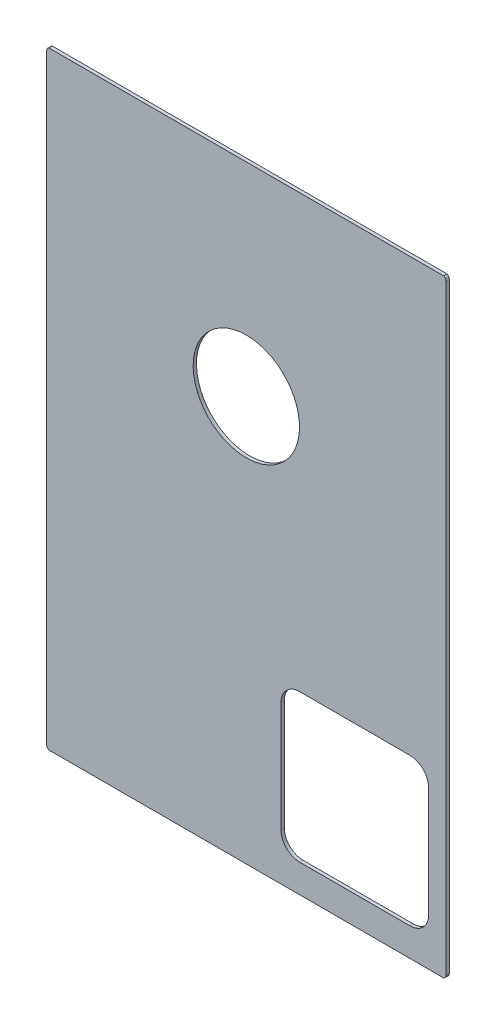
ISO-10303-21;
HEADER;
FILE_DESCRIPTION(('STEP AP214'),'2;1');
FILE_NAME('part.step','',(''),(''),'','','');
FILE_SCHEMA(('AUTOMOTIVE_DESIGN { 1 0 10303 214 1 1 1 1 }'));
ENDSEC;
DATA;
#1=APPLICATION_CONTEXT('core data for automotive mechanical design processes');
#2=APPLICATION_PROTOCOL_DEFINITION('international standard','automotive_design',2000,#1);
#3=PRODUCT_CONTEXT('',#1,'mechanical');
#4=PRODUCT('Part','Part','',(#3));
#5=PRODUCT_RELATED_PRODUCT_CATEGORY('part','',(#4));
#6=PRODUCT_DEFINITION_FORMATION('','',#4);
#7=PRODUCT_DEFINITION_CONTEXT('part definition',#1,'design');
#8=PRODUCT_DEFINITION('design','',#6,#7);
#9=PRODUCT_DEFINITION_SHAPE('','',#8);
#10=(LENGTH_UNIT() NAMED_UNIT(*) SI_UNIT(.MILLI.,.METRE.));
#11=(NAMED_UNIT(*) PLANE_ANGLE_UNIT() SI_UNIT($,.RADIAN.));
#12=(NAMED_UNIT(*) SI_UNIT($,.STERADIAN.) SOLID_ANGLE_UNIT());
#13=UNCERTAINTY_MEASURE_WITH_UNIT(LENGTH_MEASURE(1.E-05),#10,'distance_accuracy_value','');
#14=(GEOMETRIC_REPRESENTATION_CONTEXT(3) GLOBAL_UNCERTAINTY_ASSIGNED_CONTEXT((#13)) GLOBAL_UNIT_ASSIGNED_CONTEXT((#10,
#11,#12)) REPRESENTATION_CONTEXT('',''));
#15=CARTESIAN_POINT('',(0.,0.,0.));
#16=DIRECTION('',(0.,0.,1.));
#17=DIRECTION('',(1.,0.,0.));
#18=AXIS2_PLACEMENT_3D('',#15,#16,#17);
#19=CARTESIAN_POINT('',(0.,7.35,0.));
#20=DIRECTION('',(0.,-1.,0.));
#21=DIRECTION('',(0.,0.,-1.));
#22=AXIS2_PLACEMENT_3D('',#19,#20,#21);
#23=PLANE('',#22);
#24=DIRECTION('',(1.,0.,0.));
#25=VECTOR('',#24,1.);
#26=CARTESIAN_POINT('',(0.,7.35,0.));
#27=LINE('',#26,#25);
#28=CARTESIAN_POINT('',(8.5,7.35,0.));
#29=VERTEX_POINT('',#28);
#30=CARTESIAN_POINT('',(8.4000009125,7.35,0.));
#31=VERTEX_POINT('',#30);
#32=EDGE_CURVE('E175',#29,#31,#27,.F.);
#33=ORIENTED_EDGE('',*,*,#32,.F.);
#34=DIRECTION('',(0.,0.,-1.));
#35=VECTOR('',#34,1.);
#36=CARTESIAN_POINT('',(8.5,7.35,0.));
#37=LINE('',#36,#35);
#38=CARTESIAN_POINT('',(8.5,7.35,1.786));
#39=VERTEX_POINT('',#38);
#40=EDGE_CURVE('E178',#29,#39,#37,.F.);
#41=ORIENTED_EDGE('',*,*,#40,.T.);
#42=DIRECTION('',(1.,0.,0.));
#43=VECTOR('',#42,1.);
#44=CARTESIAN_POINT('',(0.,7.35,1.786));
#45=LINE('',#44,#43);
#46=CARTESIAN_POINT('',(8.4000009125,7.35,1.786));
#47=VERTEX_POINT('',#46);
#48=EDGE_CURVE('E161',#47,#39,#45,.T.);
#49=ORIENTED_EDGE('',*,*,#48,.F.);
#50=DIRECTION('',(0.,0.,-1.));
#51=VECTOR('',#50,1.);
#52=CARTESIAN_POINT('',(8.4,7.35,0.893));
#53=LINE('',#52,#51);
#54=EDGE_CURVE('E280',#47,#31,#53,.T.);
#55=ORIENTED_EDGE('',*,*,#54,.T.);
#56=EDGE_LOOP('',(#33,#41,#49,#55));
#57=FACE_BOUND('',#56,.T.);
#58=ADVANCED_FACE('F17',(#57),#23,.T.);
#59=CARTESIAN_POINT('',(217.8,0.,0.));
#60=DIRECTION('',(-1.,0.,0.));
#61=DIRECTION('',(0.,0.,1.));
#62=AXIS2_PLACEMENT_3D('',#59,#60,#61);
#63=PLANE('',#62);
#64=DIRECTION('',(0.,1.,0.));
#65=VECTOR('',#64,1.);
#66=CARTESIAN_POINT('',(217.8,0.,0.));
#67=LINE('',#66,#65);
#68=CARTESIAN_POINT('',(217.8,7.35,0.));
#69=VERTEX_POINT('',#68);
#70=CARTESIAN_POINT('',(217.8,7.55,0.));
#71=VERTEX_POINT('',#70);
#72=EDGE_CURVE('E186',#69,#71,#67,.T.);
#73=ORIENTED_EDGE('',*,*,#72,.F.);
#74=DIRECTION('',(0.,0.,-1.));
#75=VECTOR('',#74,1.);
#76=CARTESIAN_POINT('',(217.8,7.35,0.));
#77=LINE('',#76,#75);
#78=CARTESIAN_POINT('',(217.8,7.35,1.786));
#79=VERTEX_POINT('',#78);
#80=EDGE_CURVE('E277',#69,#79,#77,.F.);
#81=ORIENTED_EDGE('',*,*,#80,.T.);
#82=DIRECTION('',(0.,1.,0.));
#83=VECTOR('',#82,1.);
#84=CARTESIAN_POINT('',(217.8,0.,1.786));
#85=LINE('',#84,#83);
#86=CARTESIAN_POINT('',(217.8,7.55,1.786));
#87=VERTEX_POINT('',#86);
#88=EDGE_CURVE('E189',#87,#79,#85,.F.);
#89=ORIENTED_EDGE('',*,*,#88,.F.);
#90=DIRECTION('',(0.,0.,-1.));
#91=VECTOR('',#90,1.);
#92=CARTESIAN_POINT('',(217.8,7.55,0.));
#93=LINE('',#92,#91);
#94=EDGE_CURVE('E268',#87,#71,#93,.T.);
#95=ORIENTED_EDGE('',*,*,#94,.T.);
#96=EDGE_LOOP('',(#73,#81,#89,#95));
#97=FACE_BOUND('',#96,.T.);
#98=ADVANCED_FACE('F568',(#97),#63,.T.);
#99=CARTESIAN_POINT('',(8.5,0.,0.));
#100=DIRECTION('',(1.,0.,0.));
#101=DIRECTION('',(0.,0.,-1.));
#102=AXIS2_PLACEMENT_3D('',#99,#100,#101);
#103=PLANE('',#102);
#104=DIRECTION('',(0.,1.,0.));
#105=VECTOR('',#104,1.);
#106=CARTESIAN_POINT('',(8.5,0.,0.));
#107=LINE('',#106,#105);
#108=CARTESIAN_POINT('',(8.5,7.55,0.));
#109=VERTEX_POINT('',#108);
#110=EDGE_CURVE('E155',#109,#29,#107,.F.);
#111=ORIENTED_EDGE('',*,*,#110,.F.);
#112=DIRECTION('',(0.,0.,-1.));
#113=VECTOR('',#112,1.);
#114=CARTESIAN_POINT('',(8.5,7.55,0.));
#115=LINE('',#114,#113);
#116=CARTESIAN_POINT('',(8.5,7.55,1.786));
#117=VERTEX_POINT('',#116);
#118=EDGE_CURVE('E184',#109,#117,#115,.F.);
#119=ORIENTED_EDGE('',*,*,#118,.T.);
#120=DIRECTION('',(0.,1.,0.));
#121=VECTOR('',#120,1.);
#122=CARTESIAN_POINT('',(8.5,0.,1.786));
#123=LINE('',#122,#121);
#124=EDGE_CURVE('E167',#39,#117,#123,.T.);
#125=ORIENTED_EDGE('',*,*,#124,.F.);
#126=ORIENTED_EDGE('',*,*,#40,.F.);
#127=EDGE_LOOP('',(#111,#119,#125,#126));
#128=FACE_BOUND('',#127,.T.);
#129=ADVANCED_FACE('F182',(#128),#103,.T.);
#130=CARTESIAN_POINT('',(0.,7.35,0.));
#131=DIRECTION('',(0.,-1.,0.));
#132=DIRECTION('',(0.,0.,-1.));
#133=AXIS2_PLACEMENT_3D('',#130,#131,#132);
#134=PLANE('',#133);
#135=DIRECTION('',(1.,0.,0.));
#136=VECTOR('',#135,1.);
#137=CARTESIAN_POINT('',(0.,7.35,0.));
#138=LINE('',#137,#136);
#139=CARTESIAN_POINT('',(217.8999991,7.35,0.));
#140=VERTEX_POINT('',#139);
#141=EDGE_CURVE('E143',#140,#69,#138,.F.);
#142=ORIENTED_EDGE('',*,*,#141,.F.);
#143=DIRECTION('',(0.,0.,1.));
#144=VECTOR('',#143,1.);
#145=CARTESIAN_POINT('',(217.9,7.35,0.893));
#146=LINE('',#145,#144);
#147=CARTESIAN_POINT('',(217.8999991,7.35,1.786));
#148=VERTEX_POINT('',#147);
#149=EDGE_CURVE('E298',#140,#148,#146,.T.);
#150=ORIENTED_EDGE('',*,*,#149,.T.);
#151=DIRECTION('',(1.,0.,0.));
#152=VECTOR('',#151,1.);
#153=CARTESIAN_POINT('',(0.,7.35,1.786));
#154=LINE('',#153,#152);
#155=EDGE_CURVE('E180',#79,#148,#154,.T.);
#156=ORIENTED_EDGE('',*,*,#155,.F.);
#157=ORIENTED_EDGE('',*,*,#80,.F.);
#158=EDGE_LOOP('',(#142,#150,#156,#157));
#159=FACE_BOUND('',#158,.T.);
#160=ADVANCED_FACE('F551',(#159),#134,.T.);
#161=CARTESIAN_POINT('',(6.3,0.,0.));
#162=DIRECTION('',(-1.,0.,0.));
#163=DIRECTION('',(0.,0.,1.));
#164=AXIS2_PLACEMENT_3D('',#161,#162,#163);
#165=PLANE('',#164);
#166=DIRECTION('',(0.,1.,0.));
#167=VECTOR('',#166,1.);
#168=CARTESIAN_POINT('',(6.3,0.,0.));
#169=LINE('',#168,#167);
#170=CARTESIAN_POINT('',(6.30000001132748,331.0499991,0.));
#171=VERTEX_POINT('',#170);
#172=CARTESIAN_POINT('',(6.3,9.4500009125,0.));
#173=VERTEX_POINT('',#172);
#174=EDGE_CURVE('E223',#171,#173,#169,.F.);
#175=ORIENTED_EDGE('',*,*,#174,.T.);
#176=DIRECTION('',(0.,0.,1.));
#177=VECTOR('',#176,1.);
#178=CARTESIAN_POINT('',(6.3,9.45,0.893));
#179=LINE('',#178,#177);
#180=CARTESIAN_POINT('',(6.3,9.4500009125,1.786));
#181=VERTEX_POINT('',#180);
#182=EDGE_CURVE('E271',#173,#181,#179,.T.);
#183=ORIENTED_EDGE('',*,*,#182,.T.);
#184=DIRECTION('',(0.,1.,0.));
#185=VECTOR('',#184,1.);
#186=CARTESIAN_POINT('',(6.3,0.,1.786));
#187=LINE('',#186,#185);
#188=CARTESIAN_POINT('',(6.30000001132748,331.0499991,1.786));
#189=VERTEX_POINT('',#188);
#190=EDGE_CURVE('E248',#181,#189,#187,.T.);
#191=ORIENTED_EDGE('',*,*,#190,.T.);
#192=DIRECTION('',(0.,0.,-1.));
#193=VECTOR('',#192,1.);
#194=CARTESIAN_POINT('',(6.30000002265496,331.05,0.893));
#195=LINE('',#194,#193);
#196=EDGE_CURVE('E227',#189,#171,#195,.T.);
#197=ORIENTED_EDGE('',*,*,#196,.T.);
#198=EDGE_LOOP('',(#175,#183,#191,#197));
#199=FACE_BOUND('',#198,.T.);
#200=ADVANCED_FACE('F543',(#199),#165,.T.);
#201=CARTESIAN_POINT('',(8.400001825,9.450001825,0.));
#202=DIRECTION('',(0.,0.,1.));
#203=DIRECTION('',(1.,0.,0.));
#204=AXIS2_PLACEMENT_3D('',#201,#202,#203);
#205=CYLINDRICAL_SURFACE('',#204,2.10000182500079);
#206=CARTESIAN_POINT('',(8.400001825,9.450001825,0.));
#207=DIRECTION('',(0.,0.,1.));
#208=DIRECTION('',(1.,0.,0.));
#209=AXIS2_PLACEMENT_3D('',#206,#207,#208);
#210=CIRCLE('',#209,2.10000182500079);
#211=EDGE_CURVE('E220',#173,#31,#210,.T.);
#212=ORIENTED_EDGE('',*,*,#211,.T.);
#213=ORIENTED_EDGE('',*,*,#54,.F.);
#214=CARTESIAN_POINT('',(8.400001825,9.450001825,1.786));
#215=DIRECTION('',(0.,0.,1.));
#216=DIRECTION('',(1.,0.,0.));
#217=AXIS2_PLACEMENT_3D('',#214,#215,#216);
#218=CIRCLE('',#217,2.10000182500079);
#219=EDGE_CURVE('E171',#47,#181,#218,.F.);
#220=ORIENTED_EDGE('',*,*,#219,.T.);
#221=ORIENTED_EDGE('',*,*,#182,.F.);
#222=EDGE_LOOP('',(#212,#213,#220,#221));
#223=FACE_BOUND('',#222,.T.);
#224=ADVANCED_FACE('F535',(#223),#205,.T.);
#225=CARTESIAN_POINT('',(0.,7.55,0.));
#226=DIRECTION('',(0.,-1.,0.));
#227=DIRECTION('',(0.,0.,-1.));
#228=AXIS2_PLACEMENT_3D('',#225,#226,#227);
#229=PLANE('',#228);
#230=DIRECTION('',(1.,0.,0.));
#231=VECTOR('',#230,1.);
#232=CARTESIAN_POINT('',(0.,7.55,0.));
#233=LINE('',#232,#231);
#234=EDGE_CURVE('E219',#109,#71,#233,.T.);
#235=ORIENTED_EDGE('',*,*,#234,.T.);
#236=ORIENTED_EDGE('',*,*,#94,.F.);
#237=DIRECTION('',(1.,0.,0.));
#238=VECTOR('',#237,1.);
#239=CARTESIAN_POINT('',(0.,7.55,1.786));
#240=LINE('',#239,#238);
#241=EDGE_CURVE('E249',#87,#117,#240,.F.);
#242=ORIENTED_EDGE('',*,*,#241,.T.);
#243=ORIENTED_EDGE('',*,*,#118,.F.);
#244=EDGE_LOOP('',(#235,#236,#242,#243));
#245=FACE_BOUND('',#244,.T.);
#246=ADVANCED_FACE('F527',(#245),#229,.T.);
#247=CARTESIAN_POINT('',(217.8999982,9.450001825,0.));
#248=DIRECTION('',(0.,0.,1.));
#249=DIRECTION('',(1.,0.,0.));
#250=AXIS2_PLACEMENT_3D('',#247,#248,#249);
#251=CYLINDRICAL_SURFACE('',#250,2.10000182500077);
#252=CARTESIAN_POINT('',(217.8999982,9.450001825,0.));
#253=DIRECTION('',(0.,0.,1.));
#254=DIRECTION('',(1.,0.,0.));
#255=AXIS2_PLACEMENT_3D('',#252,#253,#254);
#256=CIRCLE('',#255,2.10000182500077);
#257=CARTESIAN_POINT('',(220.,9.4500009125,0.));
#258=VERTEX_POINT('',#257);
#259=EDGE_CURVE('E217',#140,#258,#256,.T.);
#260=ORIENTED_EDGE('',*,*,#259,.T.);
#261=DIRECTION('',(0.,0.,-1.));
#262=VECTOR('',#261,1.);
#263=CARTESIAN_POINT('',(220.,9.45,0.));
#264=LINE('',#263,#262);
#265=CARTESIAN_POINT('',(220.,9.4500009125,1.786));
#266=VERTEX_POINT('',#265);
#267=EDGE_CURVE('E134',#258,#266,#264,.F.);
#268=ORIENTED_EDGE('',*,*,#267,.T.);
#269=CARTESIAN_POINT('',(217.8999982,9.450001825,1.786));
#270=DIRECTION('',(0.,0.,1.));
#271=DIRECTION('',(1.,0.,0.));
#272=AXIS2_PLACEMENT_3D('',#269,#270,#271);
#273=CIRCLE('',#272,2.10000182500077);
#274=EDGE_CURVE('E20',#266,#148,#273,.F.);
#275=ORIENTED_EDGE('',*,*,#274,.T.);
#276=ORIENTED_EDGE('',*,*,#149,.F.);
#277=EDGE_LOOP('',(#260,#268,#275,#276));
#278=FACE_BOUND('',#277,.T.);
#279=ADVANCED_FACE('F519',(#278),#251,.T.);
#280=CARTESIAN_POINT('',(200.7,32.7,1.786));
#281=DIRECTION('',(0.,0.,-1.));
#282=DIRECTION('',(0.,1.,0.));
#283=AXIS2_PLACEMENT_3D('',#280,#281,#282);
#284=CYLINDRICAL_SURFACE('',#283,10.);
#285=CARTESIAN_POINT('',(200.7,32.7,0.));
#286=DIRECTION('',(0.,0.,-1.));
#287=DIRECTION('',(0.,1.,0.));
#288=AXIS2_PLACEMENT_3D('',#285,#286,#287);
#289=CIRCLE('',#288,10.);
#290=CARTESIAN_POINT('',(210.7,32.7,0.));
#291=VERTEX_POINT('',#290);
#292=CARTESIAN_POINT('',(200.7,22.7,0.));
#293=VERTEX_POINT('',#292);
#294=EDGE_CURVE('E214',#291,#293,#289,.T.);
#295=ORIENTED_EDGE('',*,*,#294,.T.);
#296=DIRECTION('',(0.,0.,-1.));
#297=VECTOR('',#296,1.);
#298=CARTESIAN_POINT('',(200.7,22.7,0.));
#299=LINE('',#298,#297);
#300=CARTESIAN_POINT('',(200.7,22.7,1.786));
#301=VERTEX_POINT('',#300);
#302=EDGE_CURVE('E301',#293,#301,#299,.F.);
#303=ORIENTED_EDGE('',*,*,#302,.T.);
#304=CARTESIAN_POINT('',(200.7,32.7,1.786));
#305=DIRECTION('',(0.,0.,-1.));
#306=DIRECTION('',(0.,1.,0.));
#307=AXIS2_PLACEMENT_3D('',#304,#305,#306);
#308=CIRCLE('',#307,10.);
#309=CARTESIAN_POINT('',(210.7,32.7,1.786));
#310=VERTEX_POINT('',#309);
#311=EDGE_CURVE('E233',#301,#310,#308,.F.);
#312=ORIENTED_EDGE('',*,*,#311,.T.);
#313=DIRECTION('',(0.,0.,1.));
#314=VECTOR('',#313,1.);
#315=CARTESIAN_POINT('',(210.7,32.7,0.));
#316=LINE('',#315,#314);
#317=EDGE_CURVE('E315',#310,#291,#316,.F.);
#318=ORIENTED_EDGE('',*,*,#317,.T.);
#319=EDGE_LOOP('',(#295,#303,#312,#318));
#320=FACE_BOUND('',#319,.T.);
#321=ADVANCED_FACE('F352',(#320),#284,.F.);
#322=CARTESIAN_POINT('',(0.,22.7,0.));
#323=DIRECTION('',(0.,-1.,0.));
#324=DIRECTION('',(0.,0.,-1.));
#325=AXIS2_PLACEMENT_3D('',#322,#323,#324);
#326=PLANE('',#325);
#327=DIRECTION('',(1.,0.,0.));
#328=VECTOR('',#327,1.);
#329=CARTESIAN_POINT('',(0.,22.7,0.));
#330=LINE('',#329,#328);
#331=CARTESIAN_POINT('',(141.7,22.7,0.));
#332=VERTEX_POINT('',#331);
#333=EDGE_CURVE('E213',#293,#332,#330,.F.);
#334=ORIENTED_EDGE('',*,*,#333,.T.);
#335=DIRECTION('',(0.,0.,-1.));
#336=VECTOR('',#335,1.);
#337=CARTESIAN_POINT('',(141.7,22.7,0.893));
#338=LINE('',#337,#336);
#339=CARTESIAN_POINT('',(141.7,22.7,1.786));
#340=VERTEX_POINT('',#339);
#341=EDGE_CURVE('E305',#332,#340,#338,.F.);
#342=ORIENTED_EDGE('',*,*,#341,.T.);
#343=DIRECTION('',(1.,0.,0.));
#344=VECTOR('',#343,1.);
#345=CARTESIAN_POINT('',(0.,22.7,1.786));
#346=LINE('',#345,#344);
#347=EDGE_CURVE('E236',#340,#301,#346,.T.);
#348=ORIENTED_EDGE('',*,*,#347,.T.);
#349=ORIENTED_EDGE('',*,*,#302,.F.);
#350=EDGE_LOOP('',(#334,#342,#348,#349));
#351=FACE_BOUND('',#350,.T.);
#352=ADVANCED_FACE('F354',(#351),#326,.F.);
#353=CARTESIAN_POINT('',(141.7,32.7,1.786));
#354=DIRECTION('',(0.,0.,-1.));
#355=DIRECTION('',(-1.,0.,0.));
#356=AXIS2_PLACEMENT_3D('',#353,#354,#355);
#357=CYLINDRICAL_SURFACE('',#356,10.);
#358=CARTESIAN_POINT('',(141.7,32.7,0.));
#359=DIRECTION('',(0.,0.,-1.));
#360=DIRECTION('',(-1.,0.,0.));
#361=AXIS2_PLACEMENT_3D('',#358,#359,#360);
#362=CIRCLE('',#361,10.);
#363=CARTESIAN_POINT('',(131.7,32.7,0.));
#364=VERTEX_POINT('',#363);
#365=EDGE_CURVE('E211',#332,#364,#362,.T.);
#366=ORIENTED_EDGE('',*,*,#365,.T.);
#367=DIRECTION('',(0.,0.,-1.));
#368=VECTOR('',#367,1.);
#369=CARTESIAN_POINT('',(131.7,32.7,0.));
#370=LINE('',#369,#368);
#371=CARTESIAN_POINT('',(131.7,32.7,1.786));
#372=VERTEX_POINT('',#371);
#373=EDGE_CURVE('E307',#364,#372,#370,.F.);
#374=ORIENTED_EDGE('',*,*,#373,.T.);
#375=CARTESIAN_POINT('',(141.7,32.7,1.786));
#376=DIRECTION('',(0.,0.,-1.));
#377=DIRECTION('',(-1.,0.,0.));
#378=AXIS2_PLACEMENT_3D('',#375,#376,#377);
#379=CIRCLE('',#378,10.);
#380=EDGE_CURVE('E237',#372,#340,#379,.F.);
#381=ORIENTED_EDGE('',*,*,#380,.T.);
#382=ORIENTED_EDGE('',*,*,#341,.F.);
#383=EDGE_LOOP('',(#366,#374,#381,#382));
#384=FACE_BOUND('',#383,.T.);
#385=ADVANCED_FACE('F381',(#384),#357,.F.);
#386=CARTESIAN_POINT('',(131.7,0.,0.));
#387=DIRECTION('',(1.,0.,0.));
#388=DIRECTION('',(0.,0.,-1.));
#389=AXIS2_PLACEMENT_3D('',#386,#387,#388);
#390=PLANE('',#389);
#391=ORIENTED_EDGE('',*,*,#373,.F.);
#392=DIRECTION('',(0.,1.,0.));
#393=VECTOR('',#392,1.);
#394=CARTESIAN_POINT('',(131.7,0.,0.));
#395=LINE('',#394,#393);
#396=CARTESIAN_POINT('',(131.7,91.7,0.));
#397=VERTEX_POINT('',#396);
#398=EDGE_CURVE('E210',#364,#397,#395,.T.);
#399=ORIENTED_EDGE('',*,*,#398,.T.);
#400=DIRECTION('',(0.,0.,-1.));
#401=VECTOR('',#400,1.);
#402=CARTESIAN_POINT('',(131.7,91.7,0.893));
#403=LINE('',#402,#401);
#404=CARTESIAN_POINT('',(131.7,91.7,1.786));
#405=VERTEX_POINT('',#404);
#406=EDGE_CURVE('E309',#397,#405,#403,.F.);
#407=ORIENTED_EDGE('',*,*,#406,.T.);
#408=DIRECTION('',(0.,1.,0.));
#409=VECTOR('',#408,1.);
#410=CARTESIAN_POINT('',(131.7,0.,1.786));
#411=LINE('',#410,#409);
#412=EDGE_CURVE('E240',#405,#372,#411,.F.);
#413=ORIENTED_EDGE('',*,*,#412,.T.);
#414=EDGE_LOOP('',(#391,#399,#407,#413));
#415=FACE_BOUND('',#414,.T.);
#416=ADVANCED_FACE('F379',(#415),#390,.T.);
#417=CARTESIAN_POINT('',(141.7,91.7,1.786));
#418=DIRECTION('',(0.,0.,-1.));
#419=DIRECTION('',(0.,1.,0.));
#420=AXIS2_PLACEMENT_3D('',#417,#418,#419);
#421=CYLINDRICAL_SURFACE('',#420,10.);
#422=CARTESIAN_POINT('',(141.7,91.7,0.));
#423=DIRECTION('',(0.,0.,-1.));
#424=DIRECTION('',(0.,1.,0.));
#425=AXIS2_PLACEMENT_3D('',#422,#423,#424);
#426=CIRCLE('',#425,10.);
#427=CARTESIAN_POINT('',(141.7,101.7,0.));
#428=VERTEX_POINT('',#427);
#429=EDGE_CURVE('E208',#397,#428,#426,.T.);
#430=ORIENTED_EDGE('',*,*,#429,.T.);
#431=DIRECTION('',(0.,0.,1.));
#432=VECTOR('',#431,1.);
#433=CARTESIAN_POINT('',(141.7,101.7,0.));
#434=LINE('',#433,#432);
#435=CARTESIAN_POINT('',(141.7,101.7,1.786));
#436=VERTEX_POINT('',#435);
#437=EDGE_CURVE('E311',#428,#436,#434,.T.);
#438=ORIENTED_EDGE('',*,*,#437,.T.);
#439=CARTESIAN_POINT('',(141.7,91.7,1.786));
#440=DIRECTION('',(0.,0.,-1.));
#441=DIRECTION('',(0.,1.,0.));
#442=AXIS2_PLACEMENT_3D('',#439,#440,#441);
#443=CIRCLE('',#442,10.);
#444=EDGE_CURVE('E241',#436,#405,#443,.F.);
#445=ORIENTED_EDGE('',*,*,#444,.T.);
#446=ORIENTED_EDGE('',*,*,#406,.F.);
#447=EDGE_LOOP('',(#430,#438,#445,#446));
#448=FACE_BOUND('',#447,.T.);
#449=ADVANCED_FACE('F374',(#448),#421,.F.);
#450=CARTESIAN_POINT('',(0.,101.7,0.));
#451=DIRECTION('',(0.,1.,0.));
#452=DIRECTION('',(0.,0.,1.));
#453=AXIS2_PLACEMENT_3D('',#450,#451,#452);
#454=PLANE('',#453);
#455=DIRECTION('',(1.,0.,0.));
#456=VECTOR('',#455,1.);
#457=CARTESIAN_POINT('',(0.,101.7,1.786));
#458=LINE('',#457,#456);
#459=CARTESIAN_POINT('',(200.7,101.7,1.786));
#460=VERTEX_POINT('',#459);
#461=EDGE_CURVE('E244',#460,#436,#458,.F.);
#462=ORIENTED_EDGE('',*,*,#461,.T.);
#463=ORIENTED_EDGE('',*,*,#437,.F.);
#464=DIRECTION('',(1.,0.,0.));
#465=VECTOR('',#464,1.);
#466=CARTESIAN_POINT('',(0.,101.7,0.));
#467=LINE('',#466,#465);
#468=CARTESIAN_POINT('',(200.7,101.7,0.));
#469=VERTEX_POINT('',#468);
#470=EDGE_CURVE('E207',#428,#469,#467,.T.);
#471=ORIENTED_EDGE('',*,*,#470,.T.);
#472=DIRECTION('',(0.,0.,-1.));
#473=VECTOR('',#472,1.);
#474=CARTESIAN_POINT('',(200.7,101.7,0.893));
#475=LINE('',#474,#473);
#476=EDGE_CURVE('E313',#469,#460,#475,.F.);
#477=ORIENTED_EDGE('',*,*,#476,.T.);
#478=EDGE_LOOP('',(#462,#463,#471,#477));
#479=FACE_BOUND('',#478,.T.);
#480=ADVANCED_FACE('F372',(#479),#454,.F.);
#481=CARTESIAN_POINT('',(200.7,91.7,1.786));
#482=DIRECTION('',(0.,0.,-1.));
#483=DIRECTION('',(-1.,0.,0.));
#484=AXIS2_PLACEMENT_3D('',#481,#482,#483);
#485=CYLINDRICAL_SURFACE('',#484,9.99999999999999);
#486=CARTESIAN_POINT('',(200.7,91.7,0.));
#487=DIRECTION('',(0.,0.,-1.));
#488=DIRECTION('',(-1.,0.,0.));
#489=AXIS2_PLACEMENT_3D('',#486,#487,#488);
#490=CIRCLE('',#489,9.99999999999999);
#491=CARTESIAN_POINT('',(210.7,91.7,0.));
#492=VERTEX_POINT('',#491);
#493=EDGE_CURVE('E205',#469,#492,#490,.T.);
#494=ORIENTED_EDGE('',*,*,#493,.T.);
#495=DIRECTION('',(0.,0.,1.));
#496=VECTOR('',#495,1.);
#497=CARTESIAN_POINT('',(210.7,91.7,0.));
#498=LINE('',#497,#496);
#499=CARTESIAN_POINT('',(210.7,91.7,1.786));
#500=VERTEX_POINT('',#499);
#501=EDGE_CURVE('E303',#492,#500,#498,.T.);
#502=ORIENTED_EDGE('',*,*,#501,.T.);
#503=CARTESIAN_POINT('',(200.7,91.7,1.786));
#504=DIRECTION('',(0.,0.,-1.));
#505=DIRECTION('',(-1.,0.,0.));
#506=AXIS2_PLACEMENT_3D('',#503,#504,#505);
#507=CIRCLE('',#506,9.99999999999999);
#508=EDGE_CURVE('E245',#500,#460,#507,.F.);
#509=ORIENTED_EDGE('',*,*,#508,.T.);
#510=ORIENTED_EDGE('',*,*,#476,.F.);
#511=EDGE_LOOP('',(#494,#502,#509,#510));
#512=FACE_BOUND('',#511,.T.);
#513=ADVANCED_FACE('F366',(#512),#485,.F.);
#514=CARTESIAN_POINT('',(210.7,0.,0.));
#515=DIRECTION('',(-1.,0.,0.));
#516=DIRECTION('',(0.,0.,1.));
#517=AXIS2_PLACEMENT_3D('',#514,#515,#516);
#518=PLANE('',#517);
#519=ORIENTED_EDGE('',*,*,#501,.F.);
#520=DIRECTION('',(0.,1.,0.));
#521=VECTOR('',#520,1.);
#522=CARTESIAN_POINT('',(210.7,0.,0.));
#523=LINE('',#522,#521);
#524=EDGE_CURVE('E204',#492,#291,#523,.F.);
#525=ORIENTED_EDGE('',*,*,#524,.T.);
#526=ORIENTED_EDGE('',*,*,#317,.F.);
#527=DIRECTION('',(0.,1.,0.));
#528=VECTOR('',#527,1.);
#529=CARTESIAN_POINT('',(210.7,0.,1.786));
#530=LINE('',#529,#528);
#531=EDGE_CURVE('E247',#310,#500,#530,.T.);
#532=ORIENTED_EDGE('',*,*,#531,.T.);
#533=EDGE_LOOP('',(#519,#525,#526,#532));
#534=FACE_BOUND('',#533,.T.);
#535=ADVANCED_FACE('F344',(#534),#518,.T.);
#536=CARTESIAN_POINT('',(113.145,224.253,1.786));
#537=DIRECTION('',(0.,0.,-1.));
#538=DIRECTION('',(0.,1.,0.));
#539=AXIS2_PLACEMENT_3D('',#536,#537,#538);
#540=CYLINDRICAL_SURFACE('',#539,28.4500000165081);
#541=CARTESIAN_POINT('',(113.145,224.253,0.));
#542=DIRECTION('',(0.,0.,-1.));
#543=DIRECTION('',(0.,1.,0.));
#544=AXIS2_PLACEMENT_3D('',#541,#542,#543);
#545=CIRCLE('',#544,28.4500000165081);
#546=CARTESIAN_POINT('',(113.145,252.703000016508,0.));
#547=VERTEX_POINT('',#546);
#548=EDGE_CURVE('E201',#547,#547,#545,.T.);
#549=ORIENTED_EDGE('',*,*,#548,.T.);
#550=EDGE_LOOP('',(#549));
#551=FACE_BOUND('',#550,.T.);
#552=CARTESIAN_POINT('',(113.145,224.253,1.786));
#553=DIRECTION('',(0.,0.,-1.));
#554=DIRECTION('',(0.,1.,0.));
#555=AXIS2_PLACEMENT_3D('',#552,#553,#554);
#556=CIRCLE('',#555,28.4500000252839);
#557=CARTESIAN_POINT('',(113.145,252.703000025284,1.786));
#558=VERTEX_POINT('',#557);
#559=EDGE_CURVE('E230',#558,#558,#556,.F.);
#560=ORIENTED_EDGE('',*,*,#559,.T.);
#561=EDGE_LOOP('',(#560));
#562=FACE_BOUND('',#561,.T.);
#563=ADVANCED_FACE('F415',(#551,#562),#540,.F.);
#564=CARTESIAN_POINT('',(220.,0.,0.));
#565=DIRECTION('',(1.,0.,0.));
#566=DIRECTION('',(0.,0.,-1.));
#567=AXIS2_PLACEMENT_3D('',#564,#565,#566);
#568=PLANE('',#567);
#569=DIRECTION('',(0.,1.,0.));
#570=VECTOR('',#569,1.);
#571=CARTESIAN_POINT('',(220.,0.,0.));
#572=LINE('',#571,#570);
#573=CARTESIAN_POINT('',(220.,331.0499991,0.));
#574=VERTEX_POINT('',#573);
#575=EDGE_CURVE('E216',#258,#574,#572,.T.);
#576=ORIENTED_EDGE('',*,*,#575,.T.);
#577=DIRECTION('',(0.,0.,1.));
#578=VECTOR('',#577,1.);
#579=CARTESIAN_POINT('',(220.,331.05,0.893));
#580=LINE('',#579,#578);
#581=CARTESIAN_POINT('',(220.,331.0499991,1.786));
#582=VERTEX_POINT('',#581);
#583=EDGE_CURVE('E198',#574,#582,#580,.T.);
#584=ORIENTED_EDGE('',*,*,#583,.T.);
#585=DIRECTION('',(0.,1.,0.));
#586=VECTOR('',#585,1.);
#587=CARTESIAN_POINT('',(220.,0.,1.786));
#588=LINE('',#587,#586);
#589=EDGE_CURVE('E256',#582,#266,#588,.F.);
#590=ORIENTED_EDGE('',*,*,#589,.T.);
#591=ORIENTED_EDGE('',*,*,#267,.F.);
#592=EDGE_LOOP('',(#576,#584,#590,#591));
#593=FACE_BOUND('',#592,.T.);
#594=ADVANCED_FACE('F411',(#593),#568,.T.);
#595=CARTESIAN_POINT('',(0.,0.,1.786));
#596=DIRECTION('',(0.,0.,1.));
#597=DIRECTION('',(1.,0.,0.));
#598=AXIS2_PLACEMENT_3D('',#595,#596,#597);
#599=PLANE('',#598);
#600=ORIENTED_EDGE('',*,*,#559,.F.);
#601=EDGE_LOOP('',(#600));
#602=FACE_BOUND('',#601,.T.);
#603=ORIENTED_EDGE('',*,*,#347,.F.);
#604=ORIENTED_EDGE('',*,*,#380,.F.);
#605=ORIENTED_EDGE('',*,*,#412,.F.);
#606=ORIENTED_EDGE('',*,*,#444,.F.);
#607=ORIENTED_EDGE('',*,*,#461,.F.);
#608=ORIENTED_EDGE('',*,*,#508,.F.);
#609=ORIENTED_EDGE('',*,*,#531,.F.);
#610=ORIENTED_EDGE('',*,*,#311,.F.);
#611=EDGE_LOOP('',(#603,#604,#605,#606,#607,#608,#609,#610));
#612=FACE_BOUND('',#611,.T.);
#613=CARTESIAN_POINT('',(8.400001825,331.0499982,1.786));
#614=DIRECTION('',(0.,0.,1.));
#615=DIRECTION('',(1.,0.,0.));
#616=AXIS2_PLACEMENT_3D('',#613,#614,#615);
#617=CIRCLE('',#616,2.10000180234587);
#618=CARTESIAN_POINT('',(7.505574226,332.95,1.786));
#619=VERTEX_POINT('',#618);
#620=EDGE_CURVE('E228',#619,#189,#617,.T.);
#621=ORIENTED_EDGE('',*,*,#620,.T.);
#622=ORIENTED_EDGE('',*,*,#190,.F.);
#623=ORIENTED_EDGE('',*,*,#219,.F.);
#624=ORIENTED_EDGE('',*,*,#48,.T.);
#625=ORIENTED_EDGE('',*,*,#124,.T.);
#626=ORIENTED_EDGE('',*,*,#241,.F.);
#627=ORIENTED_EDGE('',*,*,#88,.T.);
#628=ORIENTED_EDGE('',*,*,#155,.T.);
#629=ORIENTED_EDGE('',*,*,#274,.F.);
#630=ORIENTED_EDGE('',*,*,#589,.F.);
#631=CARTESIAN_POINT('',(217.8999982,331.0499982,1.786));
#632=DIRECTION('',(0.,0.,1.));
#633=DIRECTION('',(1.,0.,0.));
#634=AXIS2_PLACEMENT_3D('',#631,#632,#633);
#635=CIRCLE('',#634,2.10000180000077);
#636=CARTESIAN_POINT('',(218.794425796747,332.95,1.786));
#637=VERTEX_POINT('',#636);
#638=EDGE_CURVE('E199',#582,#637,#635,.T.);
#639=ORIENTED_EDGE('',*,*,#638,.T.);
#640=DIRECTION('',(1.,0.,0.));
#641=VECTOR('',#640,1.);
#642=CARTESIAN_POINT('',(0.,332.95,1.786));
#643=LINE('',#642,#641);
#644=EDGE_CURVE('E320',#637,#619,#643,.F.);
#645=ORIENTED_EDGE('',*,*,#644,.T.);
#646=EDGE_LOOP('',(#621,#622,#623,#624,#625,#626,#627,#628,#629,#630,#639,#645));
#647=FACE_BOUND('',#646,.T.);
#648=ADVANCED_FACE('F164',(#602,#612,#647),#599,.T.);
#649=CARTESIAN_POINT('',(8.400001825,331.0499982,0.));
#650=DIRECTION('',(0.,0.,1.));
#651=DIRECTION('',(1.,0.,0.));
#652=AXIS2_PLACEMENT_3D('',#649,#650,#651);
#653=CYLINDRICAL_SURFACE('',#652,2.10000180234587);
#654=CARTESIAN_POINT('',(8.400001825,331.0499982,0.));
#655=DIRECTION('',(0.,0.,1.));
#656=DIRECTION('',(1.,0.,0.));
#657=AXIS2_PLACEMENT_3D('',#654,#655,#656);
#658=CIRCLE('',#657,2.10000180234587);
#659=CARTESIAN_POINT('',(7.505574226,332.95,0.));
#660=VERTEX_POINT('',#659);
#661=EDGE_CURVE('E224',#660,#171,#658,.T.);
#662=ORIENTED_EDGE('',*,*,#661,.T.);
#663=ORIENTED_EDGE('',*,*,#196,.F.);
#664=ORIENTED_EDGE('',*,*,#620,.F.);
#665=DIRECTION('',(0.,0.,1.));
#666=VECTOR('',#665,1.);
#667=CARTESIAN_POINT('',(7.505574226,332.95,0.));
#668=LINE('',#667,#666);
#669=EDGE_CURVE('E330',#619,#660,#668,.F.);
#670=ORIENTED_EDGE('',*,*,#669,.T.);
#671=EDGE_LOOP('',(#662,#663,#664,#670));
#672=FACE_BOUND('',#671,.T.);
#673=ADVANCED_FACE('F404',(#672),#653,.T.);
#674=CARTESIAN_POINT('',(0.,0.,0.));
#675=DIRECTION('',(0.,0.,1.));
#676=DIRECTION('',(1.,0.,0.));
#677=AXIS2_PLACEMENT_3D('',#674,#675,#676);
#678=PLANE('',#677);
#679=ORIENTED_EDGE('',*,*,#548,.F.);
#680=EDGE_LOOP('',(#679));
#681=FACE_BOUND('',#680,.T.);
#682=ORIENTED_EDGE('',*,*,#493,.F.);
#683=ORIENTED_EDGE('',*,*,#470,.F.);
#684=ORIENTED_EDGE('',*,*,#429,.F.);
#685=ORIENTED_EDGE('',*,*,#398,.F.);
#686=ORIENTED_EDGE('',*,*,#365,.F.);
#687=ORIENTED_EDGE('',*,*,#333,.F.);
#688=ORIENTED_EDGE('',*,*,#294,.F.);
#689=ORIENTED_EDGE('',*,*,#524,.F.);
#690=EDGE_LOOP('',(#682,#683,#684,#685,#686,#687,#688,#689));
#691=FACE_BOUND('',#690,.T.);
#692=ORIENTED_EDGE('',*,*,#575,.F.);
#693=ORIENTED_EDGE('',*,*,#259,.F.);
#694=ORIENTED_EDGE('',*,*,#141,.T.);
#695=ORIENTED_EDGE('',*,*,#72,.T.);
#696=ORIENTED_EDGE('',*,*,#234,.F.);
#697=ORIENTED_EDGE('',*,*,#110,.T.);
#698=ORIENTED_EDGE('',*,*,#32,.T.);
#699=ORIENTED_EDGE('',*,*,#211,.F.);
#700=ORIENTED_EDGE('',*,*,#174,.F.);
#701=ORIENTED_EDGE('',*,*,#661,.F.);
#702=DIRECTION('',(1.,0.,0.));
#703=VECTOR('',#702,1.);
#704=CARTESIAN_POINT('',(0.,332.95,0.));
#705=LINE('',#704,#703);
#706=CARTESIAN_POINT('',(218.794425796747,332.95,0.));
#707=VERTEX_POINT('',#706);
#708=EDGE_CURVE('E26',#660,#707,#705,.T.);
#709=ORIENTED_EDGE('',*,*,#708,.T.);
#710=CARTESIAN_POINT('',(217.8999982,331.0499982,0.));
#711=DIRECTION('',(0.,0.,1.));
#712=DIRECTION('',(1.,0.,0.));
#713=AXIS2_PLACEMENT_3D('',#710,#711,#712);
#714=CIRCLE('',#713,2.10000180000077);
#715=EDGE_CURVE('E196',#707,#574,#714,.F.);
#716=ORIENTED_EDGE('',*,*,#715,.T.);
#717=EDGE_LOOP('',(#692,#693,#694,#695,#696,#697,#698,#699,#700,#701,#709,#716));
#718=FACE_BOUND('',#717,.T.);
#719=ADVANCED_FACE('F348',(#681,#691,#718),#678,.F.);
#720=CARTESIAN_POINT('',(217.8999982,331.0499982,0.));
#721=DIRECTION('',(0.,0.,1.));
#722=DIRECTION('',(1.,0.,0.));
#723=AXIS2_PLACEMENT_3D('',#720,#721,#722);
#724=CYLINDRICAL_SURFACE('',#723,2.10000180000077);
#725=ORIENTED_EDGE('',*,*,#715,.F.);
#726=DIRECTION('',(0.,0.,1.));
#727=VECTOR('',#726,1.);
#728=CARTESIAN_POINT('',(218.7944258,332.95,0.));
#729=LINE('',#728,#727);
#730=EDGE_CURVE('E11',#707,#637,#729,.T.);
#731=ORIENTED_EDGE('',*,*,#730,.T.);
#732=ORIENTED_EDGE('',*,*,#638,.F.);
#733=ORIENTED_EDGE('',*,*,#583,.F.);
#734=EDGE_LOOP('',(#725,#731,#732,#733));
#735=FACE_BOUND('',#734,.T.);
#736=ADVANCED_FACE('F393',(#735),#724,.T.);
#737=CARTESIAN_POINT('',(0.,332.95,0.));
#738=DIRECTION('',(0.,1.,0.));
#739=DIRECTION('',(0.,0.,1.));
#740=AXIS2_PLACEMENT_3D('',#737,#738,#739);
#741=PLANE('',#740);
#742=ORIENTED_EDGE('',*,*,#708,.F.);
#743=ORIENTED_EDGE('',*,*,#669,.F.);
#744=ORIENTED_EDGE('',*,*,#644,.F.);
#745=ORIENTED_EDGE('',*,*,#730,.F.);
#746=EDGE_LOOP('',(#742,#743,#744,#745));
#747=FACE_BOUND('',#746,.T.);
#748=ADVANCED_FACE('F391',(#747),#741,.T.);
#749=CLOSED_SHELL('',(#58,#98,#129,#160,#200,#224,#246,#279,#321,#352,#385,#416,#449,#480,#513,
#535,#563,#594,#648,#673,#719,#736,#748));
#750=MANIFOLD_SOLID_BREP('B1',#749);
#751=ADVANCED_BREP_SHAPE_REPRESENTATION('',(#18,#750),#14);
#752=SHAPE_DEFINITION_REPRESENTATION(#9,#751);
ENDSEC;
END-ISO-10303-21;
